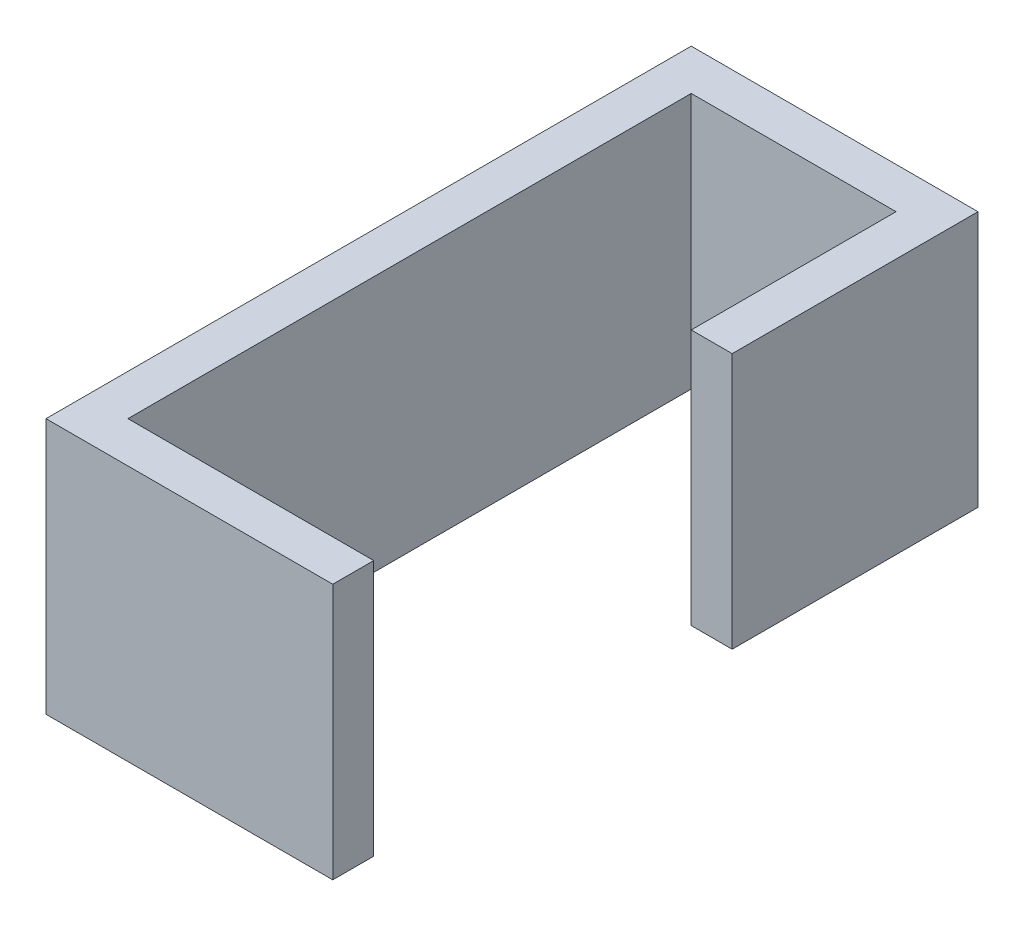
ISO-10303-21;
HEADER;
FILE_DESCRIPTION(('STEP AP214'),'2;1');
FILE_NAME('part.step','',(''),(''),'','','');
FILE_SCHEMA(('AUTOMOTIVE_DESIGN { 1 0 10303 214 1 1 1 1 }'));
ENDSEC;
DATA;
#1=APPLICATION_CONTEXT('core data for automotive mechanical design processes');
#2=APPLICATION_PROTOCOL_DEFINITION('international standard','automotive_design',2000,#1);
#3=PRODUCT_CONTEXT('',#1,'mechanical');
#4=PRODUCT('Part','Part','',(#3));
#5=PRODUCT_RELATED_PRODUCT_CATEGORY('part','',(#4));
#6=PRODUCT_DEFINITION_FORMATION('','',#4);
#7=PRODUCT_DEFINITION_CONTEXT('part definition',#1,'design');
#8=PRODUCT_DEFINITION('design','',#6,#7);
#9=PRODUCT_DEFINITION_SHAPE('','',#8);
#10=(LENGTH_UNIT() NAMED_UNIT(*) SI_UNIT(.MILLI.,.METRE.));
#11=(NAMED_UNIT(*) PLANE_ANGLE_UNIT() SI_UNIT($,.RADIAN.));
#12=(NAMED_UNIT(*) SI_UNIT($,.STERADIAN.) SOLID_ANGLE_UNIT());
#13=UNCERTAINTY_MEASURE_WITH_UNIT(LENGTH_MEASURE(1.E-05),#10,'distance_accuracy_value','');
#14=(GEOMETRIC_REPRESENTATION_CONTEXT(3) GLOBAL_UNCERTAINTY_ASSIGNED_CONTEXT((#13)) GLOBAL_UNIT_ASSIGNED_CONTEXT((#10,
#11,#12)) REPRESENTATION_CONTEXT('',''));
#15=CARTESIAN_POINT('',(0.,0.,0.));
#16=DIRECTION('',(0.,0.,1.));
#17=DIRECTION('',(1.,0.,0.));
#18=AXIS2_PLACEMENT_3D('',#15,#16,#17);
#19=CARTESIAN_POINT('',(28.,25.,0.));
#20=DIRECTION('',(0.,0.,-1.));
#21=DIRECTION('',(-1.,0.,0.));
#22=AXIS2_PLACEMENT_3D('',#19,#20,#21);
#23=PLANE('',#22);
#24=DIRECTION('',(1.,0.,0.));
#25=VECTOR('',#24,1.);
#26=CARTESIAN_POINT('',(28.,0.,0.));
#27=LINE('',#26,#25);
#28=CARTESIAN_POINT('',(0.,0.,0.));
#29=VERTEX_POINT('',#28);
#30=CARTESIAN_POINT('',(28.,0.,0.));
#31=VERTEX_POINT('',#30);
#32=EDGE_CURVE('E143',#29,#31,#27,.T.);
#33=ORIENTED_EDGE('',*,*,#32,.T.);
#34=DIRECTION('',(0.,-1.,0.));
#35=VECTOR('',#34,1.);
#36=CARTESIAN_POINT('',(28.,25.,0.));
#37=LINE('',#36,#35);
#38=CARTESIAN_POINT('',(28.,25.,0.));
#39=VERTEX_POINT('',#38);
#40=EDGE_CURVE('E11',#39,#31,#37,.T.);
#41=ORIENTED_EDGE('',*,*,#40,.F.);
#42=DIRECTION('',(1.,0.,0.));
#43=VECTOR('',#42,1.);
#44=CARTESIAN_POINT('',(28.,25.,0.));
#45=LINE('',#44,#43);
#46=CARTESIAN_POINT('',(0.,25.,0.));
#47=VERTEX_POINT('',#46);
#48=EDGE_CURVE('E161',#47,#39,#45,.T.);
#49=ORIENTED_EDGE('',*,*,#48,.F.);
#50=DIRECTION('',(0.,-1.,0.));
#51=VECTOR('',#50,1.);
#52=CARTESIAN_POINT('',(0.,25.,0.));
#53=LINE('',#52,#51);
#54=EDGE_CURVE('E139',#47,#29,#53,.T.);
#55=ORIENTED_EDGE('',*,*,#54,.T.);
#56=EDGE_LOOP('',(#33,#41,#49,#55));
#57=FACE_BOUND('',#56,.T.);
#58=ADVANCED_FACE('F35',(#57),#23,.F.);
#59=CARTESIAN_POINT('',(28.,25.,-4.));
#60=DIRECTION('',(-1.,0.,0.));
#61=DIRECTION('',(0.,0.,1.));
#62=AXIS2_PLACEMENT_3D('',#59,#60,#61);
#63=PLANE('',#62);
#64=DIRECTION('',(0.,0.,-1.));
#65=VECTOR('',#64,1.);
#66=CARTESIAN_POINT('',(28.,0.,-4.));
#67=LINE('',#66,#65);
#68=CARTESIAN_POINT('',(28.,0.,-4.));
#69=VERTEX_POINT('',#68);
#70=EDGE_CURVE('E146',#31,#69,#67,.T.);
#71=ORIENTED_EDGE('',*,*,#70,.T.);
#72=DIRECTION('',(0.,-1.,0.));
#73=VECTOR('',#72,1.);
#74=CARTESIAN_POINT('',(28.,25.,-4.));
#75=LINE('',#74,#73);
#76=CARTESIAN_POINT('',(28.,25.,-4.));
#77=VERTEX_POINT('',#76);
#78=EDGE_CURVE('E43',#77,#69,#75,.T.);
#79=ORIENTED_EDGE('',*,*,#78,.F.);
#80=DIRECTION('',(0.,0.,-1.));
#81=VECTOR('',#80,1.);
#82=CARTESIAN_POINT('',(28.,25.,-4.));
#83=LINE('',#82,#81);
#84=EDGE_CURVE('E100',#39,#77,#83,.T.);
#85=ORIENTED_EDGE('',*,*,#84,.F.);
#86=ORIENTED_EDGE('',*,*,#40,.T.);
#87=EDGE_LOOP('',(#71,#79,#85,#86));
#88=FACE_BOUND('',#87,.T.);
#89=ADVANCED_FACE('F210',(#88),#63,.F.);
#90=CARTESIAN_POINT('',(4.00000000000001,25.,-4.));
#91=DIRECTION('',(0.,0.,1.));
#92=DIRECTION('',(1.,0.,0.));
#93=AXIS2_PLACEMENT_3D('',#90,#91,#92);
#94=PLANE('',#93);
#95=DIRECTION('',(-1.,0.,0.));
#96=VECTOR('',#95,1.);
#97=CARTESIAN_POINT('',(4.00000000000001,0.,-4.));
#98=LINE('',#97,#96);
#99=CARTESIAN_POINT('',(4.00000000000001,0.,-4.));
#100=VERTEX_POINT('',#99);
#101=EDGE_CURVE('E148',#69,#100,#98,.T.);
#102=ORIENTED_EDGE('',*,*,#101,.T.);
#103=DIRECTION('',(0.,-1.,0.));
#104=VECTOR('',#103,1.);
#105=CARTESIAN_POINT('',(4.00000000000001,25.,-4.));
#106=LINE('',#105,#104);
#107=CARTESIAN_POINT('',(4.00000000000001,25.,-4.));
#108=VERTEX_POINT('',#107);
#109=EDGE_CURVE('E174',#108,#100,#106,.T.);
#110=ORIENTED_EDGE('',*,*,#109,.F.);
#111=DIRECTION('',(-1.,0.,0.));
#112=VECTOR('',#111,1.);
#113=CARTESIAN_POINT('',(4.00000000000001,25.,-4.));
#114=LINE('',#113,#112);
#115=EDGE_CURVE('E182',#77,#108,#114,.T.);
#116=ORIENTED_EDGE('',*,*,#115,.F.);
#117=ORIENTED_EDGE('',*,*,#78,.T.);
#118=EDGE_LOOP('',(#102,#110,#116,#117));
#119=FACE_BOUND('',#118,.T.);
#120=ADVANCED_FACE('F180',(#119),#94,.F.);
#121=CARTESIAN_POINT('',(4.,25.,-59.));
#122=DIRECTION('',(-1.,0.,0.));
#123=DIRECTION('',(0.,0.,1.));
#124=AXIS2_PLACEMENT_3D('',#121,#122,#123);
#125=PLANE('',#124);
#126=DIRECTION('',(0.,0.,-1.));
#127=VECTOR('',#126,1.);
#128=CARTESIAN_POINT('',(4.,0.,-59.));
#129=LINE('',#128,#127);
#130=CARTESIAN_POINT('',(4.,0.,-59.));
#131=VERTEX_POINT('',#130);
#132=EDGE_CURVE('E150',#100,#131,#129,.T.);
#133=ORIENTED_EDGE('',*,*,#132,.T.);
#134=DIRECTION('',(0.,-1.,0.));
#135=VECTOR('',#134,1.);
#136=CARTESIAN_POINT('',(4.,25.,-59.));
#137=LINE('',#136,#135);
#138=CARTESIAN_POINT('',(4.,25.,-59.));
#139=VERTEX_POINT('',#138);
#140=EDGE_CURVE('E171',#139,#131,#137,.T.);
#141=ORIENTED_EDGE('',*,*,#140,.F.);
#142=DIRECTION('',(0.,0.,-1.));
#143=VECTOR('',#142,1.);
#144=CARTESIAN_POINT('',(4.,25.,-59.));
#145=LINE('',#144,#143);
#146=EDGE_CURVE('E200',#108,#139,#145,.T.);
#147=ORIENTED_EDGE('',*,*,#146,.F.);
#148=ORIENTED_EDGE('',*,*,#109,.T.);
#149=EDGE_LOOP('',(#133,#141,#147,#148));
#150=FACE_BOUND('',#149,.T.);
#151=ADVANCED_FACE('F191',(#150),#125,.F.);
#152=CARTESIAN_POINT('',(24.,25.,-59.));
#153=DIRECTION('',(0.,0.,-1.));
#154=DIRECTION('',(-1.,0.,0.));
#155=AXIS2_PLACEMENT_3D('',#152,#153,#154);
#156=PLANE('',#155);
#157=DIRECTION('',(1.,0.,0.));
#158=VECTOR('',#157,1.);
#159=CARTESIAN_POINT('',(24.,0.,-59.));
#160=LINE('',#159,#158);
#161=CARTESIAN_POINT('',(24.,0.,-59.));
#162=VERTEX_POINT('',#161);
#163=EDGE_CURVE('E152',#131,#162,#160,.T.);
#164=ORIENTED_EDGE('',*,*,#163,.T.);
#165=DIRECTION('',(0.,-1.,0.));
#166=VECTOR('',#165,1.);
#167=CARTESIAN_POINT('',(24.,25.,-59.));
#168=LINE('',#167,#166);
#169=CARTESIAN_POINT('',(24.,25.,-59.));
#170=VERTEX_POINT('',#169);
#171=EDGE_CURVE('E168',#170,#162,#168,.T.);
#172=ORIENTED_EDGE('',*,*,#171,.F.);
#173=DIRECTION('',(1.,0.,0.));
#174=VECTOR('',#173,1.);
#175=CARTESIAN_POINT('',(24.,25.,-59.));
#176=LINE('',#175,#174);
#177=EDGE_CURVE('E197',#139,#170,#176,.T.);
#178=ORIENTED_EDGE('',*,*,#177,.F.);
#179=ORIENTED_EDGE('',*,*,#140,.T.);
#180=EDGE_LOOP('',(#164,#172,#178,#179));
#181=FACE_BOUND('',#180,.T.);
#182=ADVANCED_FACE('F195',(#181),#156,.F.);
#183=CARTESIAN_POINT('',(24.,25.,-39.));
#184=DIRECTION('',(1.,0.,0.));
#185=DIRECTION('',(0.,0.,-1.));
#186=AXIS2_PLACEMENT_3D('',#183,#184,#185);
#187=PLANE('',#186);
#188=DIRECTION('',(0.,0.,1.));
#189=VECTOR('',#188,1.);
#190=CARTESIAN_POINT('',(24.,0.,-39.));
#191=LINE('',#190,#189);
#192=CARTESIAN_POINT('',(24.,0.,-39.));
#193=VERTEX_POINT('',#192);
#194=EDGE_CURVE('E154',#162,#193,#191,.T.);
#195=ORIENTED_EDGE('',*,*,#194,.T.);
#196=DIRECTION('',(0.,-1.,0.));
#197=VECTOR('',#196,1.);
#198=CARTESIAN_POINT('',(24.,25.,-39.));
#199=LINE('',#198,#197);
#200=CARTESIAN_POINT('',(24.,25.,-39.));
#201=VERTEX_POINT('',#200);
#202=EDGE_CURVE('E165',#201,#193,#199,.T.);
#203=ORIENTED_EDGE('',*,*,#202,.F.);
#204=DIRECTION('',(0.,0.,1.));
#205=VECTOR('',#204,1.);
#206=CARTESIAN_POINT('',(24.,25.,-39.));
#207=LINE('',#206,#205);
#208=EDGE_CURVE('E199',#170,#201,#207,.T.);
#209=ORIENTED_EDGE('',*,*,#208,.F.);
#210=ORIENTED_EDGE('',*,*,#171,.T.);
#211=EDGE_LOOP('',(#195,#203,#209,#210));
#212=FACE_BOUND('',#211,.T.);
#213=ADVANCED_FACE('F222',(#212),#187,.F.);
#214=CARTESIAN_POINT('',(28.,25.,-39.));
#215=DIRECTION('',(0.,0.,-1.));
#216=DIRECTION('',(-1.,0.,0.));
#217=AXIS2_PLACEMENT_3D('',#214,#215,#216);
#218=PLANE('',#217);
#219=DIRECTION('',(1.,0.,0.));
#220=VECTOR('',#219,1.);
#221=CARTESIAN_POINT('',(28.,0.,-39.));
#222=LINE('',#221,#220);
#223=CARTESIAN_POINT('',(28.,0.,-39.));
#224=VERTEX_POINT('',#223);
#225=EDGE_CURVE('E156',#193,#224,#222,.T.);
#226=ORIENTED_EDGE('',*,*,#225,.T.);
#227=DIRECTION('',(0.,-1.,0.));
#228=VECTOR('',#227,1.);
#229=CARTESIAN_POINT('',(28.,25.,-39.));
#230=LINE('',#229,#228);
#231=CARTESIAN_POINT('',(28.,25.,-39.));
#232=VERTEX_POINT('',#231);
#233=EDGE_CURVE('E134',#232,#224,#230,.T.);
#234=ORIENTED_EDGE('',*,*,#233,.F.);
#235=DIRECTION('',(1.,0.,0.));
#236=VECTOR('',#235,1.);
#237=CARTESIAN_POINT('',(28.,25.,-39.));
#238=LINE('',#237,#236);
#239=EDGE_CURVE('E125',#201,#232,#238,.T.);
#240=ORIENTED_EDGE('',*,*,#239,.F.);
#241=ORIENTED_EDGE('',*,*,#202,.T.);
#242=EDGE_LOOP('',(#226,#234,#240,#241));
#243=FACE_BOUND('',#242,.T.);
#244=ADVANCED_FACE('F225',(#243),#218,.F.);
#245=CARTESIAN_POINT('',(28.,25.,-63.));
#246=DIRECTION('',(-1.,0.,0.));
#247=DIRECTION('',(0.,0.,1.));
#248=AXIS2_PLACEMENT_3D('',#245,#246,#247);
#249=PLANE('',#248);
#250=DIRECTION('',(0.,0.,-1.));
#251=VECTOR('',#250,1.);
#252=CARTESIAN_POINT('',(28.,0.,-63.));
#253=LINE('',#252,#251);
#254=CARTESIAN_POINT('',(28.,0.,-63.));
#255=VERTEX_POINT('',#254);
#256=EDGE_CURVE('E133',#224,#255,#253,.T.);
#257=ORIENTED_EDGE('',*,*,#256,.T.);
#258=DIRECTION('',(0.,-1.,0.));
#259=VECTOR('',#258,1.);
#260=CARTESIAN_POINT('',(28.,25.,-63.));
#261=LINE('',#260,#259);
#262=CARTESIAN_POINT('',(28.,25.,-63.));
#263=VERTEX_POINT('',#262);
#264=EDGE_CURVE('E130',#263,#255,#261,.T.);
#265=ORIENTED_EDGE('',*,*,#264,.F.);
#266=DIRECTION('',(0.,0.,-1.));
#267=VECTOR('',#266,1.);
#268=CARTESIAN_POINT('',(28.,25.,-63.));
#269=LINE('',#268,#267);
#270=EDGE_CURVE('E119',#232,#263,#269,.T.);
#271=ORIENTED_EDGE('',*,*,#270,.F.);
#272=ORIENTED_EDGE('',*,*,#233,.T.);
#273=EDGE_LOOP('',(#257,#265,#271,#272));
#274=FACE_BOUND('',#273,.T.);
#275=ADVANCED_FACE('F131',(#274),#249,.F.);
#276=CARTESIAN_POINT('',(0.,25.,-63.));
#277=DIRECTION('',(0.,0.,1.));
#278=DIRECTION('',(1.,0.,0.));
#279=AXIS2_PLACEMENT_3D('',#276,#277,#278);
#280=PLANE('',#279);
#281=DIRECTION('',(-1.,0.,0.));
#282=VECTOR('',#281,1.);
#283=CARTESIAN_POINT('',(0.,0.,-63.));
#284=LINE('',#283,#282);
#285=CARTESIAN_POINT('',(0.,0.,-63.));
#286=VERTEX_POINT('',#285);
#287=EDGE_CURVE('E86',#255,#286,#284,.T.);
#288=ORIENTED_EDGE('',*,*,#287,.T.);
#289=DIRECTION('',(0.,-1.,0.));
#290=VECTOR('',#289,1.);
#291=CARTESIAN_POINT('',(0.,25.,-63.));
#292=LINE('',#291,#290);
#293=CARTESIAN_POINT('',(0.,25.,-63.));
#294=VERTEX_POINT('',#293);
#295=EDGE_CURVE('E135',#294,#286,#292,.T.);
#296=ORIENTED_EDGE('',*,*,#295,.F.);
#297=DIRECTION('',(-1.,0.,0.));
#298=VECTOR('',#297,1.);
#299=CARTESIAN_POINT('',(0.,25.,-63.));
#300=LINE('',#299,#298);
#301=EDGE_CURVE('E123',#263,#294,#300,.T.);
#302=ORIENTED_EDGE('',*,*,#301,.F.);
#303=ORIENTED_EDGE('',*,*,#264,.T.);
#304=EDGE_LOOP('',(#288,#296,#302,#303));
#305=FACE_BOUND('',#304,.T.);
#306=ADVANCED_FACE('F137',(#305),#280,.F.);
#307=CARTESIAN_POINT('',(0.,25.,0.));
#308=DIRECTION('',(1.,0.,0.));
#309=DIRECTION('',(0.,0.,-1.));
#310=AXIS2_PLACEMENT_3D('',#307,#308,#309);
#311=PLANE('',#310);
#312=DIRECTION('',(0.,0.,1.));
#313=VECTOR('',#312,1.);
#314=CARTESIAN_POINT('',(0.,0.,0.));
#315=LINE('',#314,#313);
#316=EDGE_CURVE('E92',#286,#29,#315,.T.);
#317=ORIENTED_EDGE('',*,*,#316,.T.);
#318=ORIENTED_EDGE('',*,*,#54,.F.);
#319=DIRECTION('',(0.,0.,1.));
#320=VECTOR('',#319,1.);
#321=CARTESIAN_POINT('',(0.,25.,0.));
#322=LINE('',#321,#320);
#323=EDGE_CURVE('E51',#294,#47,#322,.T.);
#324=ORIENTED_EDGE('',*,*,#323,.F.);
#325=ORIENTED_EDGE('',*,*,#295,.T.);
#326=EDGE_LOOP('',(#317,#318,#324,#325));
#327=FACE_BOUND('',#326,.T.);
#328=ADVANCED_FACE('F234',(#327),#311,.F.);
#329=CARTESIAN_POINT('',(0.,25.,0.));
#330=DIRECTION('',(0.,-1.,0.));
#331=DIRECTION('',(0.,0.,-1.));
#332=AXIS2_PLACEMENT_3D('',#329,#330,#331);
#333=PLANE('',#332);
#334=ORIENTED_EDGE('',*,*,#48,.T.);
#335=ORIENTED_EDGE('',*,*,#84,.T.);
#336=ORIENTED_EDGE('',*,*,#115,.T.);
#337=ORIENTED_EDGE('',*,*,#146,.T.);
#338=ORIENTED_EDGE('',*,*,#177,.T.);
#339=ORIENTED_EDGE('',*,*,#208,.T.);
#340=ORIENTED_EDGE('',*,*,#239,.T.);
#341=ORIENTED_EDGE('',*,*,#270,.T.);
#342=ORIENTED_EDGE('',*,*,#301,.T.);
#343=ORIENTED_EDGE('',*,*,#323,.T.);
#344=EDGE_LOOP('',(#334,#335,#336,#337,#338,#339,#340,#341,#342,#343));
#345=FACE_BOUND('',#344,.T.);
#346=ADVANCED_FACE('F121',(#345),#333,.F.);
#347=CARTESIAN_POINT('',(0.,0.,0.));
#348=DIRECTION('',(0.,-1.,0.));
#349=DIRECTION('',(0.,0.,-1.));
#350=AXIS2_PLACEMENT_3D('',#347,#348,#349);
#351=PLANE('',#350);
#352=ORIENTED_EDGE('',*,*,#32,.F.);
#353=ORIENTED_EDGE('',*,*,#316,.F.);
#354=ORIENTED_EDGE('',*,*,#287,.F.);
#355=ORIENTED_EDGE('',*,*,#256,.F.);
#356=ORIENTED_EDGE('',*,*,#225,.F.);
#357=ORIENTED_EDGE('',*,*,#194,.F.);
#358=ORIENTED_EDGE('',*,*,#163,.F.);
#359=ORIENTED_EDGE('',*,*,#132,.F.);
#360=ORIENTED_EDGE('',*,*,#101,.F.);
#361=ORIENTED_EDGE('',*,*,#70,.F.);
#362=EDGE_LOOP('',(#352,#353,#354,#355,#356,#357,#358,#359,#360,#361));
#363=FACE_BOUND('',#362,.T.);
#364=ADVANCED_FACE('F186',(#363),#351,.T.);
#365=CLOSED_SHELL('',(#58,#89,#120,#151,#182,#213,#244,#275,#306,#328,#346,#364));
#366=MANIFOLD_SOLID_BREP('B2',#365);
#367=ADVANCED_BREP_SHAPE_REPRESENTATION('',(#18,#366),#14);
#368=SHAPE_DEFINITION_REPRESENTATION(#9,#367);
ENDSEC;
END-ISO-10303-21;
